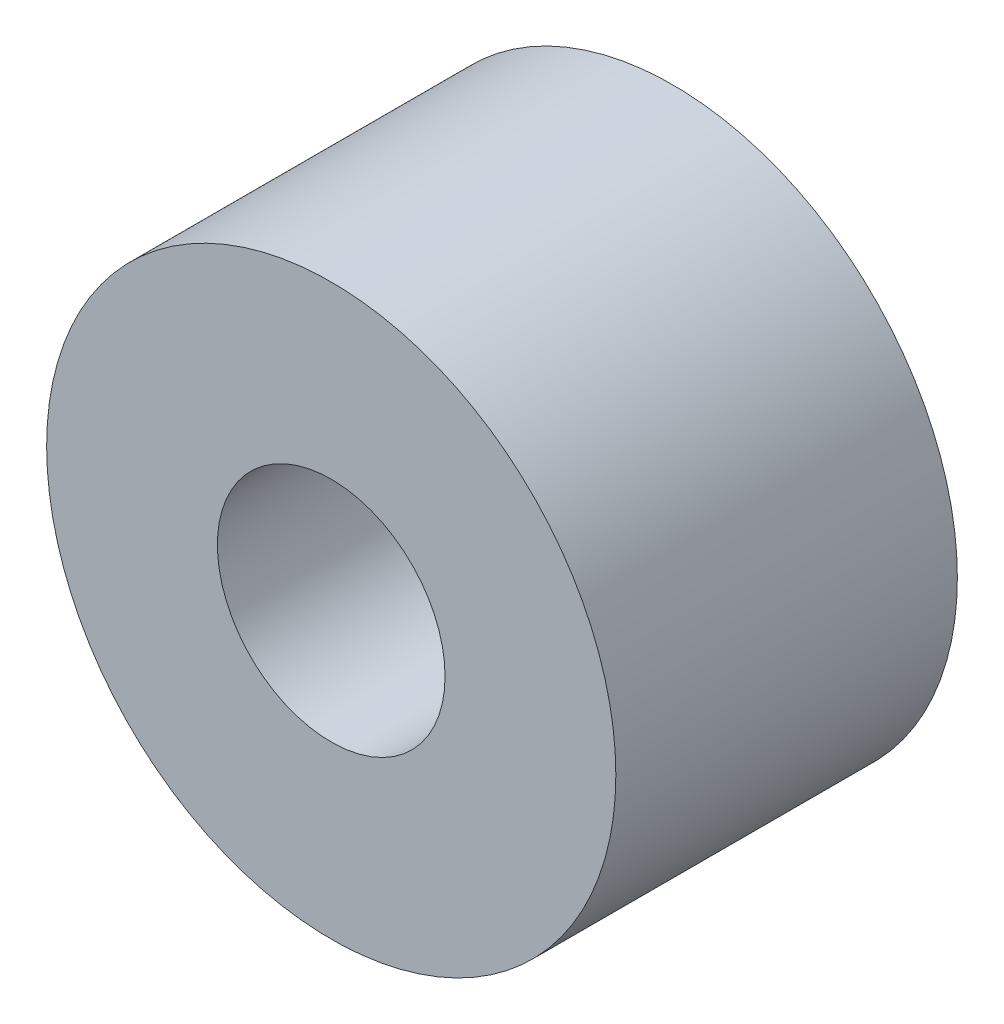
ISO-10303-21;
HEADER;
FILE_DESCRIPTION(('STEP AP214'),'2;1');
FILE_NAME('part.step','',(''),(''),'','','');
FILE_SCHEMA(('AUTOMOTIVE_DESIGN { 1 0 10303 214 1 1 1 1 }'));
ENDSEC;
DATA;
#1=APPLICATION_CONTEXT('core data for automotive mechanical design processes');
#2=APPLICATION_PROTOCOL_DEFINITION('international standard','automotive_design',2000,#1);
#3=PRODUCT_CONTEXT('',#1,'mechanical');
#4=PRODUCT('Part','Part','',(#3));
#5=PRODUCT_RELATED_PRODUCT_CATEGORY('part','',(#4));
#6=PRODUCT_DEFINITION_FORMATION('','',#4);
#7=PRODUCT_DEFINITION_CONTEXT('part definition',#1,'design');
#8=PRODUCT_DEFINITION('design','',#6,#7);
#9=PRODUCT_DEFINITION_SHAPE('','',#8);
#10=(LENGTH_UNIT() NAMED_UNIT(*) SI_UNIT(.MILLI.,.METRE.));
#11=(NAMED_UNIT(*) PLANE_ANGLE_UNIT() SI_UNIT($,.RADIAN.));
#12=(NAMED_UNIT(*) SI_UNIT($,.STERADIAN.) SOLID_ANGLE_UNIT());
#13=UNCERTAINTY_MEASURE_WITH_UNIT(LENGTH_MEASURE(1.E-05),#10,'distance_accuracy_value','');
#14=(GEOMETRIC_REPRESENTATION_CONTEXT(3) GLOBAL_UNCERTAINTY_ASSIGNED_CONTEXT((#13)) GLOBAL_UNIT_ASSIGNED_CONTEXT((#10,
#11,#12)) REPRESENTATION_CONTEXT('',''));
#15=CARTESIAN_POINT('',(0.,0.,0.));
#16=DIRECTION('',(0.,0.,1.));
#17=DIRECTION('',(1.,0.,0.));
#18=AXIS2_PLACEMENT_3D('',#15,#16,#17);
#19=CARTESIAN_POINT('',(0.,0.,3.));
#20=DIRECTION('',(0.,0.,1.));
#21=DIRECTION('',(1.,0.,0.));
#22=AXIS2_PLACEMENT_3D('',#19,#20,#21);
#23=PLANE('',#22);
#24=CARTESIAN_POINT('',(0.,0.,3.));
#25=DIRECTION('',(0.,0.,1.));
#26=DIRECTION('',(1.,0.,0.));
#27=AXIS2_PLACEMENT_3D('',#24,#25,#26);
#28=CIRCLE('',#27,2.5);
#29=CARTESIAN_POINT('',(2.5,0.,3.));
#30=VERTEX_POINT('',#29);
#31=EDGE_CURVE('E10',#30,#30,#28,.T.);
#32=ORIENTED_EDGE('',*,*,#31,.T.);
#33=EDGE_LOOP('',(#32));
#34=FACE_BOUND('',#33,.T.);
#35=CARTESIAN_POINT('',(0.,0.,3.));
#36=DIRECTION('',(0.,0.,1.));
#37=DIRECTION('',(1.,0.,0.));
#38=AXIS2_PLACEMENT_3D('',#35,#36,#37);
#39=CIRCLE('',#38,1.);
#40=CARTESIAN_POINT('',(1.,0.,3.));
#41=VERTEX_POINT('',#40);
#42=EDGE_CURVE('E48',#41,#41,#39,.T.);
#43=ORIENTED_EDGE('',*,*,#42,.F.);
#44=EDGE_LOOP('',(#43));
#45=FACE_BOUND('',#44,.T.);
#46=ADVANCED_FACE('F37',(#34,#45),#23,.T.);
#47=CARTESIAN_POINT('',(0.,0.,0.));
#48=DIRECTION('',(0.,0.,1.));
#49=DIRECTION('',(1.,0.,0.));
#50=AXIS2_PLACEMENT_3D('',#47,#48,#49);
#51=PLANE('',#50);
#52=CARTESIAN_POINT('',(0.,0.,0.));
#53=DIRECTION('',(0.,0.,1.));
#54=DIRECTION('',(1.,0.,0.));
#55=AXIS2_PLACEMENT_3D('',#52,#53,#54);
#56=CIRCLE('',#55,2.5);
#57=CARTESIAN_POINT('',(2.5,0.,0.));
#58=VERTEX_POINT('',#57);
#59=EDGE_CURVE('E41',#58,#58,#56,.T.);
#60=ORIENTED_EDGE('',*,*,#59,.F.);
#61=EDGE_LOOP('',(#60));
#62=FACE_BOUND('',#61,.T.);
#63=CARTESIAN_POINT('',(0.,0.,0.));
#64=DIRECTION('',(0.,0.,1.));
#65=DIRECTION('',(1.,0.,0.));
#66=AXIS2_PLACEMENT_3D('',#63,#64,#65);
#67=CIRCLE('',#66,1.);
#68=CARTESIAN_POINT('',(1.,0.,0.));
#69=VERTEX_POINT('',#68);
#70=EDGE_CURVE('E50',#69,#69,#67,.T.);
#71=ORIENTED_EDGE('',*,*,#70,.T.);
#72=EDGE_LOOP('',(#71));
#73=FACE_BOUND('',#72,.T.);
#74=ADVANCED_FACE('F60',(#62,#73),#51,.F.);
#75=CARTESIAN_POINT('',(0.,0.,3.));
#76=DIRECTION('',(0.,0.,-1.));
#77=DIRECTION('',(-1.,0.,0.));
#78=AXIS2_PLACEMENT_3D('',#75,#76,#77);
#79=CYLINDRICAL_SURFACE('',#78,2.5);
#80=ORIENTED_EDGE('',*,*,#31,.F.);
#81=EDGE_LOOP('',(#80));
#82=FACE_BOUND('',#81,.T.);
#83=ORIENTED_EDGE('',*,*,#59,.T.);
#84=EDGE_LOOP('',(#83));
#85=FACE_BOUND('',#84,.T.);
#86=ADVANCED_FACE('F39',(#82,#85),#79,.T.);
#87=CARTESIAN_POINT('',(0.,0.,3.));
#88=DIRECTION('',(0.,0.,-1.));
#89=DIRECTION('',(-1.,0.,0.));
#90=AXIS2_PLACEMENT_3D('',#87,#88,#89);
#91=CYLINDRICAL_SURFACE('',#90,1.);
#92=ORIENTED_EDGE('',*,*,#42,.T.);
#93=EDGE_LOOP('',(#92));
#94=FACE_BOUND('',#93,.T.);
#95=ORIENTED_EDGE('',*,*,#70,.F.);
#96=EDGE_LOOP('',(#95));
#97=FACE_BOUND('',#96,.T.);
#98=ADVANCED_FACE('F56',(#94,#97),#91,.F.);
#99=CLOSED_SHELL('',(#46,#74,#86,#98));
#100=MANIFOLD_SOLID_BREP('B2',#99);
#101=ADVANCED_BREP_SHAPE_REPRESENTATION('',(#18,#100),#14);
#102=SHAPE_DEFINITION_REPRESENTATION(#9,#101);
ENDSEC;
END-ISO-10303-21;
